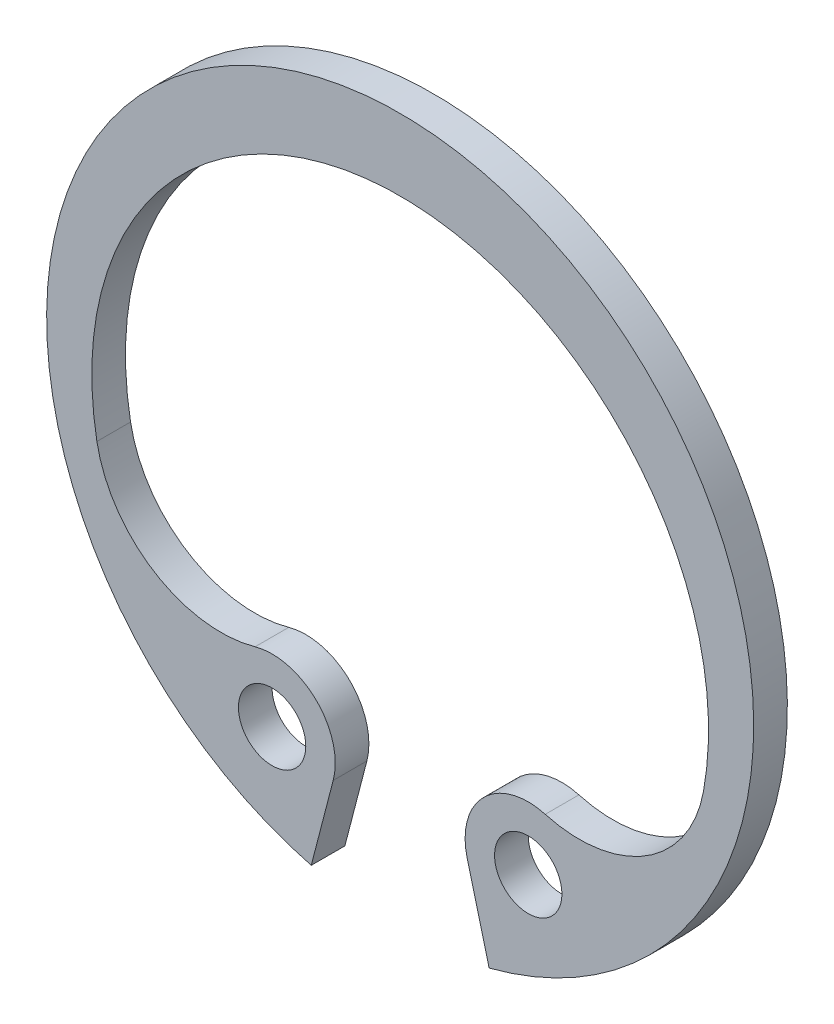
ISO-10303-21;
HEADER;
FILE_DESCRIPTION(('STEP AP214'),'2;1');
FILE_NAME('part.step','',(''),(''),'','','');
FILE_SCHEMA(('AUTOMOTIVE_DESIGN { 1 0 10303 214 1 1 1 1 }'));
ENDSEC;
DATA;
#1=APPLICATION_CONTEXT('core data for automotive mechanical design processes');
#2=APPLICATION_PROTOCOL_DEFINITION('international standard','automotive_design',2000,#1);
#3=PRODUCT_CONTEXT('',#1,'mechanical');
#4=PRODUCT('Part','Part','',(#3));
#5=PRODUCT_RELATED_PRODUCT_CATEGORY('part','',(#4));
#6=PRODUCT_DEFINITION_FORMATION('','',#4);
#7=PRODUCT_DEFINITION_CONTEXT('part definition',#1,'design');
#8=PRODUCT_DEFINITION('design','',#6,#7);
#9=PRODUCT_DEFINITION_SHAPE('','',#8);
#10=(LENGTH_UNIT() NAMED_UNIT(*) SI_UNIT(.MILLI.,.METRE.));
#11=(NAMED_UNIT(*) PLANE_ANGLE_UNIT() SI_UNIT($,.RADIAN.));
#12=(NAMED_UNIT(*) SI_UNIT($,.STERADIAN.) SOLID_ANGLE_UNIT());
#13=UNCERTAINTY_MEASURE_WITH_UNIT(LENGTH_MEASURE(1.E-05),#10,'distance_accuracy_value','');
#14=(GEOMETRIC_REPRESENTATION_CONTEXT(3) GLOBAL_UNCERTAINTY_ASSIGNED_CONTEXT((#13)) GLOBAL_UNIT_ASSIGNED_CONTEXT((#10,
#11,#12)) REPRESENTATION_CONTEXT('',''));
#15=CARTESIAN_POINT('',(0.,0.,0.));
#16=DIRECTION('',(0.,0.,1.));
#17=DIRECTION('',(1.,0.,0.));
#18=AXIS2_PLACEMENT_3D('',#15,#16,#17);
#19=CARTESIAN_POINT('',(0.,0.,-0.4));
#20=DIRECTION('',(0.,0.,1.));
#21=DIRECTION('',(1.,0.,0.));
#22=AXIS2_PLACEMENT_3D('',#19,#20,#21);
#23=CYLINDRICAL_SURFACE('',#22,4.2);
#24=CARTESIAN_POINT('',(0.,0.,0.));
#25=DIRECTION('',(0.,0.,1.));
#26=DIRECTION('',(1.,0.,0.));
#27=AXIS2_PLACEMENT_3D('',#24,#25,#26);
#28=CIRCLE('',#27,4.2);
#29=CARTESIAN_POINT('',(1.05666440772694,-4.0649059434928,0.));
#30=VERTEX_POINT('',#29);
#31=CARTESIAN_POINT('',(-1.05666440772694,-4.0649059434928,0.));
#32=VERTEX_POINT('',#31);
#33=EDGE_CURVE('E130',#30,#32,#28,.T.);
#34=ORIENTED_EDGE('',*,*,#33,.F.);
#35=DIRECTION('',(0.,0.,1.));
#36=VECTOR('',#35,1.);
#37=CARTESIAN_POINT('',(1.05666440772694,-4.0649059434928,-0.4));
#38=LINE('',#37,#36);
#39=CARTESIAN_POINT('',(1.05666440772694,-4.0649059434928,-0.4));
#40=VERTEX_POINT('',#39);
#41=EDGE_CURVE('E11',#40,#30,#38,.T.);
#42=ORIENTED_EDGE('',*,*,#41,.F.);
#43=CARTESIAN_POINT('',(0.,0.,-0.4));
#44=DIRECTION('',(0.,0.,1.));
#45=DIRECTION('',(1.,0.,0.));
#46=AXIS2_PLACEMENT_3D('',#43,#44,#45);
#47=CIRCLE('',#46,4.2);
#48=CARTESIAN_POINT('',(-1.05666440772694,-4.0649059434928,-0.4));
#49=VERTEX_POINT('',#48);
#50=EDGE_CURVE('E151',#40,#49,#47,.T.);
#51=ORIENTED_EDGE('',*,*,#50,.T.);
#52=DIRECTION('',(0.,0.,1.));
#53=VECTOR('',#52,1.);
#54=CARTESIAN_POINT('',(-1.05666440772694,-4.0649059434928,-0.4));
#55=LINE('',#54,#53);
#56=EDGE_CURVE('E36',#49,#32,#55,.T.);
#57=ORIENTED_EDGE('',*,*,#56,.T.);
#58=EDGE_LOOP('',(#34,#42,#51,#57));
#59=FACE_BOUND('',#58,.T.);
#60=ADVANCED_FACE('F33',(#59),#23,.T.);
#61=CARTESIAN_POINT('',(1.05666440772694,-4.0649059434928,-0.4));
#62=DIRECTION('',(-0.967834748450666,-0.25158676374451,0.));
#63=DIRECTION('',(0.25158676374451,-0.967834748450666,0.));
#64=AXIS2_PLACEMENT_3D('',#61,#62,#63);
#65=PLANE('',#64);
#66=DIRECTION('',(0.25158676374451,-0.967834748450666,0.));
#67=VECTOR('',#66,1.);
#68=CARTESIAN_POINT('',(1.05666440772694,-4.0649059434928,0.));
#69=LINE('',#68,#67);
#70=CARTESIAN_POINT('',(0.795587202583321,-3.06056220376023,0.));
#71=VERTEX_POINT('',#70);
#72=EDGE_CURVE('E149',#71,#30,#69,.T.);
#73=ORIENTED_EDGE('',*,*,#72,.F.);
#74=DIRECTION('',(0.,0.,1.));
#75=VECTOR('',#74,1.);
#76=CARTESIAN_POINT('',(0.795587202583321,-3.06056220376023,-0.4));
#77=LINE('',#76,#75);
#78=CARTESIAN_POINT('',(0.795587202583321,-3.06056220376023,-0.4));
#79=VERTEX_POINT('',#78);
#80=EDGE_CURVE('E42',#79,#71,#77,.T.);
#81=ORIENTED_EDGE('',*,*,#80,.F.);
#82=DIRECTION('',(0.25158676374451,-0.967834748450666,0.));
#83=VECTOR('',#82,1.);
#84=CARTESIAN_POINT('',(1.05666440772694,-4.0649059434928,-0.4));
#85=LINE('',#84,#83);
#86=EDGE_CURVE('E120',#79,#40,#85,.T.);
#87=ORIENTED_EDGE('',*,*,#86,.T.);
#88=ORIENTED_EDGE('',*,*,#41,.T.);
#89=EDGE_LOOP('',(#73,#81,#87,#88));
#90=FACE_BOUND('',#89,.T.);
#91=ADVANCED_FACE('F163',(#90),#65,.T.);
#92=CARTESIAN_POINT('',(1.52146326392132,-2.87187213095184,-0.4));
#93=DIRECTION('',(0.,0.,1.));
#94=DIRECTION('',(1.,0.,0.));
#95=AXIS2_PLACEMENT_3D('',#92,#93,#94);
#96=CYLINDRICAL_SURFACE('',#95,0.75);
#97=CARTESIAN_POINT('',(1.52146326392132,-2.87187213095184,0.));
#98=DIRECTION('',(0.,0.,1.));
#99=DIRECTION('',(1.,0.,0.));
#100=AXIS2_PLACEMENT_3D('',#97,#98,#99);
#101=CIRCLE('',#100,0.75);
#102=CARTESIAN_POINT('',(1.72356119820575,-2.14961426498016,0.));
#103=VERTEX_POINT('',#102);
#104=EDGE_CURVE('E107',#103,#71,#101,.T.);
#105=ORIENTED_EDGE('',*,*,#104,.F.);
#106=DIRECTION('',(0.,0.,1.));
#107=VECTOR('',#106,1.);
#108=CARTESIAN_POINT('',(1.72356119820575,-2.14961426498016,-0.4));
#109=LINE('',#108,#107);
#110=CARTESIAN_POINT('',(1.72356119820575,-2.14961426498016,-0.4));
#111=VERTEX_POINT('',#110);
#112=EDGE_CURVE('E102',#111,#103,#109,.T.);
#113=ORIENTED_EDGE('',*,*,#112,.F.);
#114=CARTESIAN_POINT('',(1.52146326392132,-2.87187213095184,-0.4));
#115=DIRECTION('',(0.,0.,1.));
#116=DIRECTION('',(1.,0.,0.));
#117=AXIS2_PLACEMENT_3D('',#114,#115,#116);
#118=CIRCLE('',#117,0.75);
#119=EDGE_CURVE('E105',#111,#79,#118,.T.);
#120=ORIENTED_EDGE('',*,*,#119,.T.);
#121=ORIENTED_EDGE('',*,*,#80,.T.);
#122=EDGE_LOOP('',(#105,#113,#120,#121));
#123=FACE_BOUND('',#122,.T.);
#124=ADVANCED_FACE('F104',(#123),#96,.T.);
#125=CARTESIAN_POINT('',(2.1277570667746,-0.705098533036798,-0.4));
#126=DIRECTION('',(0.,0.,1.));
#127=DIRECTION('',(1.,0.,0.));
#128=AXIS2_PLACEMENT_3D('',#125,#126,#127);
#129=CYLINDRICAL_SURFACE('',#128,1.5);
#130=CARTESIAN_POINT('',(2.1277570667746,-0.705098533036798,0.));
#131=DIRECTION('',(0.,0.,-1.));
#132=DIRECTION('',(1.,0.,0.));
#133=AXIS2_PLACEMENT_3D('',#130,#131,#132);
#134=CIRCLE('',#133,1.5);
#135=CARTESIAN_POINT('',(3.6029801040488,-0.976607262722386,0.));
#136=VERTEX_POINT('',#135);
#137=EDGE_CURVE('E146',#136,#103,#134,.T.);
#138=ORIENTED_EDGE('',*,*,#137,.F.);
#139=DIRECTION('',(0.,0.,1.));
#140=VECTOR('',#139,1.);
#141=CARTESIAN_POINT('',(3.6029801040488,-0.976607262722386,-0.4));
#142=LINE('',#141,#140);
#143=CARTESIAN_POINT('',(3.6029801040488,-0.976607262722386,-0.4));
#144=VERTEX_POINT('',#143);
#145=EDGE_CURVE('E112',#144,#136,#142,.T.);
#146=ORIENTED_EDGE('',*,*,#145,.F.);
#147=CARTESIAN_POINT('',(2.1277570667746,-0.705098533036798,-0.4));
#148=DIRECTION('',(0.,0.,-1.));
#149=DIRECTION('',(1.,0.,0.));
#150=AXIS2_PLACEMENT_3D('',#147,#148,#149);
#151=CIRCLE('',#150,1.5);
#152=EDGE_CURVE('E118',#144,#111,#151,.T.);
#153=ORIENTED_EDGE('',*,*,#152,.T.);
#154=ORIENTED_EDGE('',*,*,#112,.T.);
#155=EDGE_LOOP('',(#138,#146,#153,#154));
#156=FACE_BOUND('',#155,.T.);
#157=ADVANCED_FACE('F122',(#156),#129,.F.);
#158=CARTESIAN_POINT('',(0.,-0.313493600302736,-0.4));
#159=DIRECTION('',(0.,0.,1.));
#160=DIRECTION('',(1.,0.,0.));
#161=AXIS2_PLACEMENT_3D('',#158,#159,#160);
#162=CYLINDRICAL_SURFACE('',#161,3.66349360030274);
#163=CARTESIAN_POINT('',(0.,-0.313493600302736,0.));
#164=DIRECTION('',(0.,0.,-1.));
#165=DIRECTION('',(1.,0.,0.));
#166=AXIS2_PLACEMENT_3D('',#163,#164,#165);
#167=CIRCLE('',#166,3.66349360030274);
#168=CARTESIAN_POINT('',(-3.6029801040488,-0.976607262722383,0.));
#169=VERTEX_POINT('',#168);
#170=EDGE_CURVE('E143',#169,#136,#167,.T.);
#171=ORIENTED_EDGE('',*,*,#170,.F.);
#172=DIRECTION('',(0.,0.,1.));
#173=VECTOR('',#172,1.);
#174=CARTESIAN_POINT('',(-3.6029801040488,-0.976607262722383,-0.4));
#175=LINE('',#174,#173);
#176=CARTESIAN_POINT('',(-3.6029801040488,-0.976607262722383,-0.4));
#177=VERTEX_POINT('',#176);
#178=EDGE_CURVE('E155',#177,#169,#175,.T.);
#179=ORIENTED_EDGE('',*,*,#178,.F.);
#180=CARTESIAN_POINT('',(0.,-0.313493600302736,-0.4));
#181=DIRECTION('',(0.,0.,-1.));
#182=DIRECTION('',(1.,0.,0.));
#183=AXIS2_PLACEMENT_3D('',#180,#181,#182);
#184=CIRCLE('',#183,3.66349360030274);
#185=EDGE_CURVE('E123',#177,#144,#184,.T.);
#186=ORIENTED_EDGE('',*,*,#185,.T.);
#187=ORIENTED_EDGE('',*,*,#145,.T.);
#188=EDGE_LOOP('',(#171,#179,#186,#187));
#189=FACE_BOUND('',#188,.T.);
#190=ADVANCED_FACE('F176',(#189),#162,.F.);
#191=CARTESIAN_POINT('',(-2.1277570667746,-0.705098533036797,-0.4));
#192=DIRECTION('',(0.,0.,1.));
#193=DIRECTION('',(1.,0.,0.));
#194=AXIS2_PLACEMENT_3D('',#191,#192,#193);
#195=CYLINDRICAL_SURFACE('',#194,1.5);
#196=CARTESIAN_POINT('',(-2.1277570667746,-0.705098533036797,0.));
#197=DIRECTION('',(0.,0.,-1.));
#198=DIRECTION('',(1.,0.,0.));
#199=AXIS2_PLACEMENT_3D('',#196,#197,#198);
#200=CIRCLE('',#199,1.5);
#201=CARTESIAN_POINT('',(-1.72356119820575,-2.14961426498016,0.));
#202=VERTEX_POINT('',#201);
#203=EDGE_CURVE('E140',#202,#169,#200,.T.);
#204=ORIENTED_EDGE('',*,*,#203,.F.);
#205=DIRECTION('',(0.,0.,1.));
#206=VECTOR('',#205,1.);
#207=CARTESIAN_POINT('',(-1.72356119820575,-2.14961426498016,-0.4));
#208=LINE('',#207,#206);
#209=CARTESIAN_POINT('',(-1.72356119820575,-2.14961426498016,-0.4));
#210=VERTEX_POINT('',#209);
#211=EDGE_CURVE('E157',#210,#202,#208,.T.);
#212=ORIENTED_EDGE('',*,*,#211,.F.);
#213=CARTESIAN_POINT('',(-2.1277570667746,-0.705098533036797,-0.4));
#214=DIRECTION('',(0.,0.,-1.));
#215=DIRECTION('',(1.,0.,0.));
#216=AXIS2_PLACEMENT_3D('',#213,#214,#215);
#217=CIRCLE('',#216,1.5);
#218=EDGE_CURVE('E125',#210,#177,#217,.T.);
#219=ORIENTED_EDGE('',*,*,#218,.T.);
#220=ORIENTED_EDGE('',*,*,#178,.T.);
#221=EDGE_LOOP('',(#204,#212,#219,#220));
#222=FACE_BOUND('',#221,.T.);
#223=ADVANCED_FACE('F179',(#222),#195,.F.);
#224=CARTESIAN_POINT('',(-1.52146326392132,-2.87187213095184,-0.4));
#225=DIRECTION('',(0.,0.,1.));
#226=DIRECTION('',(1.,0.,0.));
#227=AXIS2_PLACEMENT_3D('',#224,#225,#226);
#228=CYLINDRICAL_SURFACE('',#227,0.75);
#229=CARTESIAN_POINT('',(-1.52146326392132,-2.87187213095184,0.));
#230=DIRECTION('',(0.,0.,1.));
#231=DIRECTION('',(1.,0.,0.));
#232=AXIS2_PLACEMENT_3D('',#229,#230,#231);
#233=CIRCLE('',#232,0.75);
#234=CARTESIAN_POINT('',(-0.795587202583322,-3.06056220376022,0.));
#235=VERTEX_POINT('',#234);
#236=EDGE_CURVE('E137',#235,#202,#233,.T.);
#237=ORIENTED_EDGE('',*,*,#236,.F.);
#238=DIRECTION('',(0.,0.,1.));
#239=VECTOR('',#238,1.);
#240=CARTESIAN_POINT('',(-0.795587202583322,-3.06056220376022,-0.4));
#241=LINE('',#240,#239);
#242=CARTESIAN_POINT('',(-0.795587202583322,-3.06056220376022,-0.4));
#243=VERTEX_POINT('',#242);
#244=EDGE_CURVE('E158',#243,#235,#241,.T.);
#245=ORIENTED_EDGE('',*,*,#244,.F.);
#246=CARTESIAN_POINT('',(-1.52146326392132,-2.87187213095184,-0.4));
#247=DIRECTION('',(0.,0.,1.));
#248=DIRECTION('',(1.,0.,0.));
#249=AXIS2_PLACEMENT_3D('',#246,#247,#248);
#250=CIRCLE('',#249,0.75);
#251=EDGE_CURVE('E225',#243,#210,#250,.T.);
#252=ORIENTED_EDGE('',*,*,#251,.T.);
#253=ORIENTED_EDGE('',*,*,#211,.T.);
#254=EDGE_LOOP('',(#237,#245,#252,#253));
#255=FACE_BOUND('',#254,.T.);
#256=ADVANCED_FACE('F183',(#255),#228,.T.);
#257=CARTESIAN_POINT('',(-1.05666440772694,-4.0649059434928,-0.4));
#258=DIRECTION('',(0.967834748450666,-0.251586763744509,0.));
#259=DIRECTION('',(0.251586763744509,0.967834748450666,0.));
#260=AXIS2_PLACEMENT_3D('',#257,#258,#259);
#261=PLANE('',#260);
#262=DIRECTION('',(0.251586763744509,0.967834748450666,0.));
#263=VECTOR('',#262,1.);
#264=CARTESIAN_POINT('',(-1.05666440772694,-4.0649059434928,0.));
#265=LINE('',#264,#263);
#266=EDGE_CURVE('E133',#32,#235,#265,.T.);
#267=ORIENTED_EDGE('',*,*,#266,.F.);
#268=ORIENTED_EDGE('',*,*,#56,.F.);
#269=DIRECTION('',(0.251586763744509,0.967834748450666,0.));
#270=VECTOR('',#269,1.);
#271=CARTESIAN_POINT('',(-1.05666440772694,-4.0649059434928,-0.4));
#272=LINE('',#271,#270);
#273=EDGE_CURVE('E223',#49,#243,#272,.T.);
#274=ORIENTED_EDGE('',*,*,#273,.T.);
#275=ORIENTED_EDGE('',*,*,#244,.T.);
#276=EDGE_LOOP('',(#267,#268,#274,#275));
#277=FACE_BOUND('',#276,.T.);
#278=ADVANCED_FACE('F160',(#277),#261,.T.);
#279=CARTESIAN_POINT('',(0.,0.,-0.4));
#280=DIRECTION('',(0.,0.,1.));
#281=DIRECTION('',(1.,0.,0.));
#282=AXIS2_PLACEMENT_3D('',#279,#280,#281);
#283=PLANE('',#282);
#284=CARTESIAN_POINT('',(-1.52146326392132,-2.87187213095184,-0.4));
#285=DIRECTION('',(0.,0.,1.));
#286=DIRECTION('',(1.,0.,0.));
#287=AXIS2_PLACEMENT_3D('',#284,#285,#286);
#288=CIRCLE('',#287,0.4);
#289=CARTESIAN_POINT('',(-1.12146326392132,-2.87187213095184,-0.4));
#290=VERTEX_POINT('',#289);
#291=EDGE_CURVE('E210',#290,#290,#288,.T.);
#292=ORIENTED_EDGE('',*,*,#291,.T.);
#293=EDGE_LOOP('',(#292));
#294=FACE_BOUND('',#293,.T.);
#295=CARTESIAN_POINT('',(1.52146326392132,-2.87187213095184,-0.4));
#296=DIRECTION('',(0.,0.,1.));
#297=DIRECTION('',(1.,0.,0.));
#298=AXIS2_PLACEMENT_3D('',#295,#296,#297);
#299=CIRCLE('',#298,0.4);
#300=CARTESIAN_POINT('',(1.92146326392132,-2.87187213095184,-0.4));
#301=VERTEX_POINT('',#300);
#302=EDGE_CURVE('E134',#301,#301,#299,.T.);
#303=ORIENTED_EDGE('',*,*,#302,.T.);
#304=EDGE_LOOP('',(#303));
#305=FACE_BOUND('',#304,.T.);
#306=ORIENTED_EDGE('',*,*,#50,.F.);
#307=ORIENTED_EDGE('',*,*,#86,.F.);
#308=ORIENTED_EDGE('',*,*,#119,.F.);
#309=ORIENTED_EDGE('',*,*,#152,.F.);
#310=ORIENTED_EDGE('',*,*,#185,.F.);
#311=ORIENTED_EDGE('',*,*,#218,.F.);
#312=ORIENTED_EDGE('',*,*,#251,.F.);
#313=ORIENTED_EDGE('',*,*,#273,.F.);
#314=EDGE_LOOP('',(#306,#307,#308,#309,#310,#311,#312,#313));
#315=FACE_BOUND('',#314,.T.);
#316=ADVANCED_FACE('F116',(#294,#305,#315),#283,.F.);
#317=CARTESIAN_POINT('',(0.,0.,0.));
#318=DIRECTION('',(0.,0.,1.));
#319=DIRECTION('',(1.,0.,0.));
#320=AXIS2_PLACEMENT_3D('',#317,#318,#319);
#321=PLANE('',#320);
#322=CARTESIAN_POINT('',(-1.52146326392132,-2.87187213095184,0.));
#323=DIRECTION('',(0.,0.,1.));
#324=DIRECTION('',(1.,0.,0.));
#325=AXIS2_PLACEMENT_3D('',#322,#323,#324);
#326=CIRCLE('',#325,0.4);
#327=CARTESIAN_POINT('',(-1.12146326392132,-2.87187213095184,0.));
#328=VERTEX_POINT('',#327);
#329=EDGE_CURVE('E213',#328,#328,#326,.T.);
#330=ORIENTED_EDGE('',*,*,#329,.F.);
#331=EDGE_LOOP('',(#330));
#332=FACE_BOUND('',#331,.T.);
#333=CARTESIAN_POINT('',(1.52146326392132,-2.87187213095184,0.));
#334=DIRECTION('',(0.,0.,1.));
#335=DIRECTION('',(1.,0.,0.));
#336=AXIS2_PLACEMENT_3D('',#333,#334,#335);
#337=CIRCLE('',#336,0.4);
#338=CARTESIAN_POINT('',(1.92146326392132,-2.87187213095184,0.));
#339=VERTEX_POINT('',#338);
#340=EDGE_CURVE('E215',#339,#339,#337,.T.);
#341=ORIENTED_EDGE('',*,*,#340,.F.);
#342=EDGE_LOOP('',(#341));
#343=FACE_BOUND('',#342,.T.);
#344=ORIENTED_EDGE('',*,*,#33,.T.);
#345=ORIENTED_EDGE('',*,*,#266,.T.);
#346=ORIENTED_EDGE('',*,*,#236,.T.);
#347=ORIENTED_EDGE('',*,*,#203,.T.);
#348=ORIENTED_EDGE('',*,*,#170,.T.);
#349=ORIENTED_EDGE('',*,*,#137,.T.);
#350=ORIENTED_EDGE('',*,*,#104,.T.);
#351=ORIENTED_EDGE('',*,*,#72,.T.);
#352=EDGE_LOOP('',(#344,#345,#346,#347,#348,#349,#350,#351));
#353=FACE_BOUND('',#352,.T.);
#354=ADVANCED_FACE('F162',(#332,#343,#353),#321,.T.);
#355=CARTESIAN_POINT('',(1.52146326392132,-2.87187213095184,-0.4));
#356=DIRECTION('',(0.,0.,1.));
#357=DIRECTION('',(1.,0.,0.));
#358=AXIS2_PLACEMENT_3D('',#355,#356,#357);
#359=CYLINDRICAL_SURFACE('',#358,0.4);
#360=ORIENTED_EDGE('',*,*,#302,.F.);
#361=EDGE_LOOP('',(#360));
#362=FACE_BOUND('',#361,.T.);
#363=ORIENTED_EDGE('',*,*,#340,.T.);
#364=EDGE_LOOP('',(#363));
#365=FACE_BOUND('',#364,.T.);
#366=ADVANCED_FACE('F195',(#362,#365),#359,.F.);
#367=CARTESIAN_POINT('',(-1.52146326392132,-2.87187213095184,-0.4));
#368=DIRECTION('',(0.,0.,1.));
#369=DIRECTION('',(1.,0.,0.));
#370=AXIS2_PLACEMENT_3D('',#367,#368,#369);
#371=CYLINDRICAL_SURFACE('',#370,0.4);
#372=ORIENTED_EDGE('',*,*,#291,.F.);
#373=EDGE_LOOP('',(#372));
#374=FACE_BOUND('',#373,.T.);
#375=ORIENTED_EDGE('',*,*,#329,.T.);
#376=EDGE_LOOP('',(#375));
#377=FACE_BOUND('',#376,.T.);
#378=ADVANCED_FACE('F202',(#374,#377),#371,.F.);
#379=CLOSED_SHELL('',(#60,#91,#124,#157,#190,#223,#256,#278,#316,#354,#366,#378));
#380=MANIFOLD_SOLID_BREP('B2',#379);
#381=ADVANCED_BREP_SHAPE_REPRESENTATION('',(#18,#380),#14);
#382=SHAPE_DEFINITION_REPRESENTATION(#9,#381);
ENDSEC;
END-ISO-10303-21;
